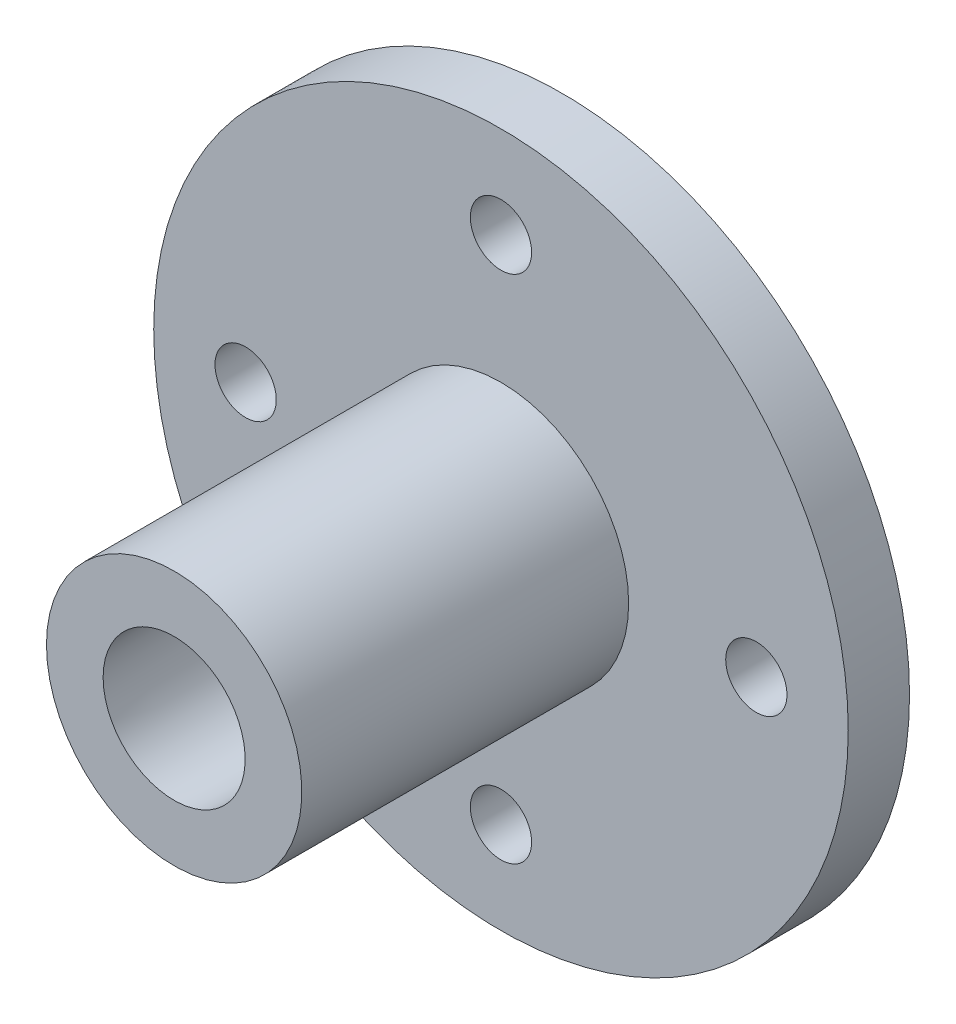
ISO-10303-21;
HEADER;
FILE_DESCRIPTION(('STEP AP214'),'2;1');
FILE_NAME('part.step','',(''),(''),'','','');
FILE_SCHEMA(('AUTOMOTIVE_DESIGN { 1 0 10303 214 1 1 1 1 }'));
ENDSEC;
DATA;
#1=APPLICATION_CONTEXT('core data for automotive mechanical design processes');
#2=APPLICATION_PROTOCOL_DEFINITION('international standard','automotive_design',2000,#1);
#3=PRODUCT_CONTEXT('',#1,'mechanical');
#4=PRODUCT('Part','Part','',(#3));
#5=PRODUCT_RELATED_PRODUCT_CATEGORY('part','',(#4));
#6=PRODUCT_DEFINITION_FORMATION('','',#4);
#7=PRODUCT_DEFINITION_CONTEXT('part definition',#1,'design');
#8=PRODUCT_DEFINITION('design','',#6,#7);
#9=PRODUCT_DEFINITION_SHAPE('','',#8);
#10=(LENGTH_UNIT() NAMED_UNIT(*) SI_UNIT(.MILLI.,.METRE.));
#11=(NAMED_UNIT(*) PLANE_ANGLE_UNIT() SI_UNIT($,.RADIAN.));
#12=(NAMED_UNIT(*) SI_UNIT($,.STERADIAN.) SOLID_ANGLE_UNIT());
#13=UNCERTAINTY_MEASURE_WITH_UNIT(LENGTH_MEASURE(1.E-05),#10,'distance_accuracy_value','');
#14=(GEOMETRIC_REPRESENTATION_CONTEXT(3) GLOBAL_UNCERTAINTY_ASSIGNED_CONTEXT((#13)) GLOBAL_UNIT_ASSIGNED_CONTEXT((#10,
#11,#12)) REPRESENTATION_CONTEXT('',''));
#15=CARTESIAN_POINT('',(0.,0.,0.));
#16=DIRECTION('',(0.,0.,1.));
#17=DIRECTION('',(1.,0.,0.));
#18=AXIS2_PLACEMENT_3D('',#15,#16,#17);
#19=CARTESIAN_POINT('',(12.5,0.,3.));
#20=DIRECTION('',(0.,0.,-1.));
#21=DIRECTION('',(-1.,0.,0.));
#22=AXIS2_PLACEMENT_3D('',#19,#20,#21);
#23=CYLINDRICAL_SURFACE('',#22,1.50000000000013);
#24=CARTESIAN_POINT('',(12.5,0.,3.));
#25=DIRECTION('',(0.,0.,-1.));
#26=DIRECTION('',(-1.,0.,0.));
#27=AXIS2_PLACEMENT_3D('',#24,#25,#26);
#28=CIRCLE('',#27,1.50000000000013);
#29=CARTESIAN_POINT('',(10.9999999999999,0.,3.));
#30=VERTEX_POINT('',#29);
#31=EDGE_CURVE('E68',#30,#30,#28,.T.);
#32=ORIENTED_EDGE('',*,*,#31,.F.);
#33=EDGE_LOOP('',(#32));
#34=FACE_BOUND('',#33,.T.);
#35=CARTESIAN_POINT('',(12.5,0.,0.25));
#36=DIRECTION('',(0.,0.,-1.));
#37=DIRECTION('',(-1.,0.,0.));
#38=AXIS2_PLACEMENT_3D('',#35,#36,#37);
#39=CIRCLE('',#38,1.50000000000013);
#40=CARTESIAN_POINT('',(10.9999999999999,0.,0.25));
#41=VERTEX_POINT('',#40);
#42=EDGE_CURVE('E216',#41,#41,#39,.T.);
#43=ORIENTED_EDGE('',*,*,#42,.T.);
#44=EDGE_LOOP('',(#43));
#45=FACE_BOUND('',#44,.T.);
#46=ADVANCED_FACE('F45',(#34,#45),#23,.F.);
#47=CARTESIAN_POINT('',(0.,-12.5,3.));
#48=DIRECTION('',(0.,0.,-1.));
#49=DIRECTION('',(-1.,0.,0.));
#50=AXIS2_PLACEMENT_3D('',#47,#48,#49);
#51=CYLINDRICAL_SURFACE('',#50,1.50000000000008);
#52=CARTESIAN_POINT('',(0.,-12.5,3.));
#53=DIRECTION('',(0.,0.,-1.));
#54=DIRECTION('',(-1.,0.,0.));
#55=AXIS2_PLACEMENT_3D('',#52,#53,#54);
#56=CIRCLE('',#55,1.50000000000008);
#57=CARTESIAN_POINT('',(-1.50000000000009,-12.5,3.));
#58=VERTEX_POINT('',#57);
#59=EDGE_CURVE('E78',#58,#58,#56,.T.);
#60=ORIENTED_EDGE('',*,*,#59,.F.);
#61=EDGE_LOOP('',(#60));
#62=FACE_BOUND('',#61,.T.);
#63=CARTESIAN_POINT('',(0.,-12.5,0.25));
#64=DIRECTION('',(0.,0.,-1.));
#65=DIRECTION('',(-1.,0.,0.));
#66=AXIS2_PLACEMENT_3D('',#63,#64,#65);
#67=CIRCLE('',#66,1.50000000000009);
#68=CARTESIAN_POINT('',(-1.50000000000009,-12.5,0.25));
#69=VERTEX_POINT('',#68);
#70=EDGE_CURVE('E204',#69,#69,#67,.T.);
#71=ORIENTED_EDGE('',*,*,#70,.T.);
#72=EDGE_LOOP('',(#71));
#73=FACE_BOUND('',#72,.T.);
#74=ADVANCED_FACE('F109',(#62,#73),#51,.F.);
#75=CARTESIAN_POINT('',(-12.5,0.,3.));
#76=DIRECTION('',(0.,0.,-1.));
#77=DIRECTION('',(-1.,0.,0.));
#78=AXIS2_PLACEMENT_3D('',#75,#76,#77);
#79=CYLINDRICAL_SURFACE('',#78,1.50000000000004);
#80=CARTESIAN_POINT('',(-12.5,0.,3.));
#81=DIRECTION('',(0.,0.,-1.));
#82=DIRECTION('',(-1.,0.,0.));
#83=AXIS2_PLACEMENT_3D('',#80,#81,#82);
#84=CIRCLE('',#83,1.50000000000004);
#85=CARTESIAN_POINT('',(-14.,0.,3.));
#86=VERTEX_POINT('',#85);
#87=EDGE_CURVE('E74',#86,#86,#84,.T.);
#88=ORIENTED_EDGE('',*,*,#87,.F.);
#89=EDGE_LOOP('',(#88));
#90=FACE_BOUND('',#89,.T.);
#91=CARTESIAN_POINT('',(-12.5,0.,0.25));
#92=DIRECTION('',(0.,0.,-1.));
#93=DIRECTION('',(-1.,0.,0.));
#94=AXIS2_PLACEMENT_3D('',#91,#92,#93);
#95=CIRCLE('',#94,1.50000000000004);
#96=CARTESIAN_POINT('',(-14.,0.,0.25));
#97=VERTEX_POINT('',#96);
#98=EDGE_CURVE('E199',#97,#97,#95,.T.);
#99=ORIENTED_EDGE('',*,*,#98,.T.);
#100=EDGE_LOOP('',(#99));
#101=FACE_BOUND('',#100,.T.);
#102=ADVANCED_FACE('F115',(#90,#101),#79,.F.);
#103=CARTESIAN_POINT('',(0.,12.5,3.));
#104=DIRECTION('',(0.,0.,-1.));
#105=DIRECTION('',(-1.,0.,0.));
#106=AXIS2_PLACEMENT_3D('',#103,#104,#105);
#107=CYLINDRICAL_SURFACE('',#106,1.5);
#108=CARTESIAN_POINT('',(0.,12.5,3.));
#109=DIRECTION('',(0.,0.,-1.));
#110=DIRECTION('',(-1.,0.,0.));
#111=AXIS2_PLACEMENT_3D('',#108,#109,#110);
#112=CIRCLE('',#111,1.5);
#113=CARTESIAN_POINT('',(-1.5,12.5,3.));
#114=VERTEX_POINT('',#113);
#115=EDGE_CURVE('E69',#114,#114,#112,.T.);
#116=ORIENTED_EDGE('',*,*,#115,.F.);
#117=EDGE_LOOP('',(#116));
#118=FACE_BOUND('',#117,.T.);
#119=CARTESIAN_POINT('',(0.,12.5,0.25));
#120=DIRECTION('',(0.,0.,-1.));
#121=DIRECTION('',(-1.,0.,0.));
#122=AXIS2_PLACEMENT_3D('',#119,#120,#121);
#123=CIRCLE('',#122,1.5);
#124=CARTESIAN_POINT('',(-1.5,12.5,0.25));
#125=VERTEX_POINT('',#124);
#126=EDGE_CURVE('E178',#125,#125,#123,.T.);
#127=ORIENTED_EDGE('',*,*,#126,.T.);
#128=EDGE_LOOP('',(#127));
#129=FACE_BOUND('',#128,.T.);
#130=ADVANCED_FACE('F123',(#118,#129),#107,.F.);
#131=CARTESIAN_POINT('',(0.,0.,3.));
#132=DIRECTION('',(0.,0.,-1.));
#133=DIRECTION('',(-1.,0.,0.));
#134=AXIS2_PLACEMENT_3D('',#131,#132,#133);
#135=CYLINDRICAL_SURFACE('',#134,17.);
#136=CARTESIAN_POINT('',(0.,0.,3.));
#137=DIRECTION('',(0.,0.,1.));
#138=DIRECTION('',(1.,0.,0.));
#139=AXIS2_PLACEMENT_3D('',#136,#137,#138);
#140=CIRCLE('',#139,17.);
#141=CARTESIAN_POINT('',(17.,0.,3.));
#142=VERTEX_POINT('',#141);
#143=EDGE_CURVE('E59',#142,#142,#140,.T.);
#144=ORIENTED_EDGE('',*,*,#143,.F.);
#145=EDGE_LOOP('',(#144));
#146=FACE_BOUND('',#145,.T.);
#147=CARTESIAN_POINT('',(0.,0.,0.));
#148=DIRECTION('',(0.,0.,1.));
#149=DIRECTION('',(1.,0.,0.));
#150=AXIS2_PLACEMENT_3D('',#147,#148,#149);
#151=CIRCLE('',#150,17.);
#152=CARTESIAN_POINT('',(17.,0.,0.));
#153=VERTEX_POINT('',#152);
#154=EDGE_CURVE('E73',#153,#153,#151,.T.);
#155=ORIENTED_EDGE('',*,*,#154,.T.);
#156=EDGE_LOOP('',(#155));
#157=FACE_BOUND('',#156,.T.);
#158=ADVANCED_FACE('F47',(#146,#157),#135,.T.);
#159=CARTESIAN_POINT('',(0.,0.,3.));
#160=DIRECTION('',(0.,0.,1.));
#161=DIRECTION('',(1.,0.,0.));
#162=AXIS2_PLACEMENT_3D('',#159,#160,#161);
#163=PLANE('',#162);
#164=CARTESIAN_POINT('',(0.,0.,3.));
#165=DIRECTION('',(0.,0.,1.));
#166=DIRECTION('',(1.,0.,0.));
#167=AXIS2_PLACEMENT_3D('',#164,#165,#166);
#168=CIRCLE('',#167,6.25);
#169=CARTESIAN_POINT('',(6.25,0.,3.));
#170=VERTEX_POINT('',#169);
#171=EDGE_CURVE('E11',#170,#170,#168,.T.);
#172=ORIENTED_EDGE('',*,*,#171,.F.);
#173=EDGE_LOOP('',(#172));
#174=FACE_BOUND('',#173,.T.);
#175=ORIENTED_EDGE('',*,*,#115,.T.);
#176=EDGE_LOOP('',(#175));
#177=FACE_BOUND('',#176,.T.);
#178=ORIENTED_EDGE('',*,*,#87,.T.);
#179=EDGE_LOOP('',(#178));
#180=FACE_BOUND('',#179,.T.);
#181=ORIENTED_EDGE('',*,*,#59,.T.);
#182=EDGE_LOOP('',(#181));
#183=FACE_BOUND('',#182,.T.);
#184=ORIENTED_EDGE('',*,*,#31,.T.);
#185=EDGE_LOOP('',(#184));
#186=FACE_BOUND('',#185,.T.);
#187=ORIENTED_EDGE('',*,*,#143,.T.);
#188=EDGE_LOOP('',(#187));
#189=FACE_BOUND('',#188,.T.);
#190=ADVANCED_FACE('F95',(#174,#177,#180,#183,#186,#189),#163,.T.);
#191=CARTESIAN_POINT('',(0.,0.,0.));
#192=DIRECTION('',(0.,0.,1.));
#193=DIRECTION('',(1.,0.,0.));
#194=AXIS2_PLACEMENT_3D('',#191,#192,#193);
#195=PLANE('',#194);
#196=CARTESIAN_POINT('',(0.,12.5,0.));
#197=DIRECTION('',(0.,0.,-1.));
#198=DIRECTION('',(-1.,0.,0.));
#199=AXIS2_PLACEMENT_3D('',#196,#197,#198);
#200=CIRCLE('',#199,1.85);
#201=CARTESIAN_POINT('',(-1.85,12.5,0.));
#202=VERTEX_POINT('',#201);
#203=EDGE_CURVE('E184',#202,#202,#200,.T.);
#204=ORIENTED_EDGE('',*,*,#203,.F.);
#205=EDGE_LOOP('',(#204));
#206=FACE_BOUND('',#205,.T.);
#207=CARTESIAN_POINT('',(-12.5,0.,0.));
#208=DIRECTION('',(0.,0.,-1.));
#209=DIRECTION('',(-1.,0.,0.));
#210=AXIS2_PLACEMENT_3D('',#207,#208,#209);
#211=CIRCLE('',#210,1.85);
#212=CARTESIAN_POINT('',(-14.35,0.,0.));
#213=VERTEX_POINT('',#212);
#214=EDGE_CURVE('E195',#213,#213,#211,.T.);
#215=ORIENTED_EDGE('',*,*,#214,.F.);
#216=EDGE_LOOP('',(#215));
#217=FACE_BOUND('',#216,.T.);
#218=CARTESIAN_POINT('',(0.,-12.5,0.));
#219=DIRECTION('',(0.,0.,-1.));
#220=DIRECTION('',(-1.,0.,0.));
#221=AXIS2_PLACEMENT_3D('',#218,#219,#220);
#222=CIRCLE('',#221,1.85);
#223=CARTESIAN_POINT('',(-1.85,-12.5,0.));
#224=VERTEX_POINT('',#223);
#225=EDGE_CURVE('E208',#224,#224,#222,.T.);
#226=ORIENTED_EDGE('',*,*,#225,.F.);
#227=EDGE_LOOP('',(#226));
#228=FACE_BOUND('',#227,.T.);
#229=CARTESIAN_POINT('',(12.5,0.,0.));
#230=DIRECTION('',(0.,0.,-1.));
#231=DIRECTION('',(-1.,0.,0.));
#232=AXIS2_PLACEMENT_3D('',#229,#230,#231);
#233=CIRCLE('',#232,1.85);
#234=CARTESIAN_POINT('',(10.65,0.,0.));
#235=VERTEX_POINT('',#234);
#236=EDGE_CURVE('E220',#235,#235,#233,.T.);
#237=ORIENTED_EDGE('',*,*,#236,.F.);
#238=EDGE_LOOP('',(#237));
#239=FACE_BOUND('',#238,.T.);
#240=CARTESIAN_POINT('',(0.,0.,0.));
#241=DIRECTION('',(0.,0.,1.));
#242=DIRECTION('',(1.,0.,0.));
#243=AXIS2_PLACEMENT_3D('',#240,#241,#242);
#244=CIRCLE('',#243,6.25);
#245=CARTESIAN_POINT('',(6.25,0.,0.));
#246=VERTEX_POINT('',#245);
#247=EDGE_CURVE('E49',#246,#246,#244,.F.);
#248=ORIENTED_EDGE('',*,*,#247,.F.);
#249=EDGE_LOOP('',(#248));
#250=FACE_BOUND('',#249,.T.);
#251=ORIENTED_EDGE('',*,*,#154,.F.);
#252=EDGE_LOOP('',(#251));
#253=FACE_BOUND('',#252,.T.);
#254=ADVANCED_FACE('F92',(#206,#217,#228,#239,#250,#253),#195,.F.);
#255=CARTESIAN_POINT('',(0.,0.,-1.));
#256=DIRECTION('',(0.,0.,1.));
#257=DIRECTION('',(1.,0.,0.));
#258=AXIS2_PLACEMENT_3D('',#255,#256,#257);
#259=CYLINDRICAL_SURFACE('',#258,6.25);
#260=CARTESIAN_POINT('',(0.,0.,-1.));
#261=DIRECTION('',(0.,0.,-1.));
#262=DIRECTION('',(-1.,0.,0.));
#263=AXIS2_PLACEMENT_3D('',#260,#261,#262);
#264=CIRCLE('',#263,6.25);
#265=CARTESIAN_POINT('',(-6.25,0.,-1.));
#266=VERTEX_POINT('',#265);
#267=EDGE_CURVE('E64',#266,#266,#264,.T.);
#268=ORIENTED_EDGE('',*,*,#267,.F.);
#269=EDGE_LOOP('',(#268));
#270=FACE_BOUND('',#269,.T.);
#271=ORIENTED_EDGE('',*,*,#247,.T.);
#272=EDGE_LOOP('',(#271));
#273=FACE_BOUND('',#272,.T.);
#274=ADVANCED_FACE('F94',(#270,#273),#259,.T.);
#275=CARTESIAN_POINT('',(0.,0.,-1.));
#276=DIRECTION('',(0.,0.,-1.));
#277=DIRECTION('',(-1.,0.,0.));
#278=AXIS2_PLACEMENT_3D('',#275,#276,#277);
#279=PLANE('',#278);
#280=CARTESIAN_POINT('',(0.,0.,-1.));
#281=DIRECTION('',(0.,0.,-1.));
#282=DIRECTION('',(-1.,0.,0.));
#283=AXIS2_PLACEMENT_3D('',#280,#281,#282);
#284=CIRCLE('',#283,4.);
#285=CARTESIAN_POINT('',(-4.,0.,-1.));
#286=VERTEX_POINT('',#285);
#287=EDGE_CURVE('E183',#286,#286,#284,.T.);
#288=ORIENTED_EDGE('',*,*,#287,.F.);
#289=EDGE_LOOP('',(#288));
#290=FACE_BOUND('',#289,.T.);
#291=ORIENTED_EDGE('',*,*,#267,.T.);
#292=EDGE_LOOP('',(#291));
#293=FACE_BOUND('',#292,.T.);
#294=ADVANCED_FACE('F101',(#290,#293),#279,.T.);
#295=CARTESIAN_POINT('',(0.,0.,19.));
#296=DIRECTION('',(0.,0.,-1.));
#297=DIRECTION('',(-1.,0.,0.));
#298=AXIS2_PLACEMENT_3D('',#295,#296,#297);
#299=CYLINDRICAL_SURFACE('',#298,6.25);
#300=ORIENTED_EDGE('',*,*,#171,.T.);
#301=EDGE_LOOP('',(#300));
#302=FACE_BOUND('',#301,.T.);
#303=CARTESIAN_POINT('',(0.,0.,19.));
#304=DIRECTION('',(0.,0.,-1.));
#305=DIRECTION('',(-1.,0.,0.));
#306=AXIS2_PLACEMENT_3D('',#303,#304,#305);
#307=CIRCLE('',#306,6.25);
#308=CARTESIAN_POINT('',(-6.25,0.,19.));
#309=VERTEX_POINT('',#308);
#310=EDGE_CURVE('E62',#309,#309,#307,.T.);
#311=ORIENTED_EDGE('',*,*,#310,.T.);
#312=EDGE_LOOP('',(#311));
#313=FACE_BOUND('',#312,.T.);
#314=ADVANCED_FACE('F130',(#302,#313),#299,.T.);
#315=CARTESIAN_POINT('',(0.,0.,19.));
#316=DIRECTION('',(0.,0.,-1.));
#317=DIRECTION('',(-1.,0.,0.));
#318=AXIS2_PLACEMENT_3D('',#315,#316,#317);
#319=PLANE('',#318);
#320=CARTESIAN_POINT('',(0.,0.,19.));
#321=DIRECTION('',(0.,0.,-1.));
#322=DIRECTION('',(-1.,0.,0.));
#323=AXIS2_PLACEMENT_3D('',#320,#321,#322);
#324=CIRCLE('',#323,3.47628156861626);
#325=CARTESIAN_POINT('',(-3.47628156861626,0.,19.));
#326=VERTEX_POINT('',#325);
#327=EDGE_CURVE('E189',#326,#326,#324,.T.);
#328=ORIENTED_EDGE('',*,*,#327,.T.);
#329=EDGE_LOOP('',(#328));
#330=FACE_BOUND('',#329,.T.);
#331=ORIENTED_EDGE('',*,*,#310,.F.);
#332=EDGE_LOOP('',(#331));
#333=FACE_BOUND('',#332,.T.);
#334=ADVANCED_FACE('F134',(#330,#333),#319,.F.);
#335=CARTESIAN_POINT('',(0.,0.,-1.));
#336=DIRECTION('',(0.,0.,-1.));
#337=DIRECTION('',(-1.,0.,0.));
#338=AXIS2_PLACEMENT_3D('',#335,#336,#337);
#339=CONICAL_SURFACE('',#338,4.,0.026179938779915);
#340=ORIENTED_EDGE('',*,*,#327,.F.);
#341=EDGE_LOOP('',(#340));
#342=FACE_BOUND('',#341,.T.);
#343=ORIENTED_EDGE('',*,*,#287,.T.);
#344=EDGE_LOOP('',(#343));
#345=FACE_BOUND('',#344,.T.);
#346=ADVANCED_FACE('F137',(#342,#345),#339,.F.);
#347=CARTESIAN_POINT('',(0.,12.5,0.25));
#348=DIRECTION('',(0.,0.,-1.));
#349=DIRECTION('',(-1.,0.,0.));
#350=AXIS2_PLACEMENT_3D('',#347,#348,#349);
#351=CYLINDRICAL_SURFACE('',#350,1.85);
#352=CARTESIAN_POINT('',(0.,12.5,0.25));
#353=DIRECTION('',(0.,0.,-1.));
#354=DIRECTION('',(-1.,0.,0.));
#355=AXIS2_PLACEMENT_3D('',#352,#353,#354);
#356=CIRCLE('',#355,1.85);
#357=CARTESIAN_POINT('',(-1.85,12.5,0.25));
#358=VERTEX_POINT('',#357);
#359=EDGE_CURVE('E181',#358,#358,#356,.T.);
#360=ORIENTED_EDGE('',*,*,#359,.F.);
#361=EDGE_LOOP('',(#360));
#362=FACE_BOUND('',#361,.T.);
#363=ORIENTED_EDGE('',*,*,#203,.T.);
#364=EDGE_LOOP('',(#363));
#365=FACE_BOUND('',#364,.T.);
#366=ADVANCED_FACE('F141',(#362,#365),#351,.F.);
#367=CARTESIAN_POINT('',(0.,12.5,0.25));
#368=DIRECTION('',(0.,0.,-1.));
#369=DIRECTION('',(-1.,0.,0.));
#370=AXIS2_PLACEMENT_3D('',#367,#368,#369);
#371=PLANE('',#370);
#372=ORIENTED_EDGE('',*,*,#126,.F.);
#373=EDGE_LOOP('',(#372));
#374=FACE_BOUND('',#373,.T.);
#375=ORIENTED_EDGE('',*,*,#359,.T.);
#376=EDGE_LOOP('',(#375));
#377=FACE_BOUND('',#376,.T.);
#378=ADVANCED_FACE('F166',(#374,#377),#371,.T.);
#379=CARTESIAN_POINT('',(-12.5,0.,0.25));
#380=DIRECTION('',(0.,0.,-1.));
#381=DIRECTION('',(-1.,0.,0.));
#382=AXIS2_PLACEMENT_3D('',#379,#380,#381);
#383=CYLINDRICAL_SURFACE('',#382,1.85);
#384=CARTESIAN_POINT('',(-12.5,0.,0.25));
#385=DIRECTION('',(0.,0.,-1.));
#386=DIRECTION('',(-1.,0.,0.));
#387=AXIS2_PLACEMENT_3D('',#384,#385,#386);
#388=CIRCLE('',#387,1.85);
#389=CARTESIAN_POINT('',(-14.35,0.,0.25));
#390=VERTEX_POINT('',#389);
#391=EDGE_CURVE('E200',#390,#390,#388,.T.);
#392=ORIENTED_EDGE('',*,*,#391,.F.);
#393=EDGE_LOOP('',(#392));
#394=FACE_BOUND('',#393,.T.);
#395=ORIENTED_EDGE('',*,*,#214,.T.);
#396=EDGE_LOOP('',(#395));
#397=FACE_BOUND('',#396,.T.);
#398=ADVANCED_FACE('F162',(#394,#397),#383,.F.);
#399=CARTESIAN_POINT('',(-12.5,0.,0.25));
#400=DIRECTION('',(0.,0.,-1.));
#401=DIRECTION('',(-1.,0.,0.));
#402=AXIS2_PLACEMENT_3D('',#399,#400,#401);
#403=PLANE('',#402);
#404=ORIENTED_EDGE('',*,*,#98,.F.);
#405=EDGE_LOOP('',(#404));
#406=FACE_BOUND('',#405,.T.);
#407=ORIENTED_EDGE('',*,*,#391,.T.);
#408=EDGE_LOOP('',(#407));
#409=FACE_BOUND('',#408,.T.);
#410=ADVANCED_FACE('F158',(#406,#409),#403,.T.);
#411=CARTESIAN_POINT('',(0.,-12.5,0.25));
#412=DIRECTION('',(0.,0.,-1.));
#413=DIRECTION('',(-1.,0.,0.));
#414=AXIS2_PLACEMENT_3D('',#411,#412,#413);
#415=CYLINDRICAL_SURFACE('',#414,1.85);
#416=CARTESIAN_POINT('',(0.,-12.5,0.25));
#417=DIRECTION('',(0.,0.,-1.));
#418=DIRECTION('',(-1.,0.,0.));
#419=AXIS2_PLACEMENT_3D('',#416,#417,#418);
#420=CIRCLE('',#419,1.85);
#421=CARTESIAN_POINT('',(-1.85,-12.5,0.25));
#422=VERTEX_POINT('',#421);
#423=EDGE_CURVE('E212',#422,#422,#420,.T.);
#424=ORIENTED_EDGE('',*,*,#423,.F.);
#425=EDGE_LOOP('',(#424));
#426=FACE_BOUND('',#425,.T.);
#427=ORIENTED_EDGE('',*,*,#225,.T.);
#428=EDGE_LOOP('',(#427));
#429=FACE_BOUND('',#428,.T.);
#430=ADVANCED_FACE('F154',(#426,#429),#415,.F.);
#431=CARTESIAN_POINT('',(0.,-12.5,0.25));
#432=DIRECTION('',(0.,0.,-1.));
#433=DIRECTION('',(-1.,0.,0.));
#434=AXIS2_PLACEMENT_3D('',#431,#432,#433);
#435=PLANE('',#434);
#436=ORIENTED_EDGE('',*,*,#70,.F.);
#437=EDGE_LOOP('',(#436));
#438=FACE_BOUND('',#437,.T.);
#439=ORIENTED_EDGE('',*,*,#423,.T.);
#440=EDGE_LOOP('',(#439));
#441=FACE_BOUND('',#440,.T.);
#442=ADVANCED_FACE('F150',(#438,#441),#435,.T.);
#443=CARTESIAN_POINT('',(12.5,0.,0.25));
#444=DIRECTION('',(0.,0.,-1.));
#445=DIRECTION('',(-1.,0.,0.));
#446=AXIS2_PLACEMENT_3D('',#443,#444,#445);
#447=CYLINDRICAL_SURFACE('',#446,1.85);
#448=CARTESIAN_POINT('',(12.5,0.,0.25));
#449=DIRECTION('',(0.,0.,-1.));
#450=DIRECTION('',(-1.,0.,0.));
#451=AXIS2_PLACEMENT_3D('',#448,#449,#450);
#452=CIRCLE('',#451,1.85);
#453=CARTESIAN_POINT('',(10.65,0.,0.25));
#454=VERTEX_POINT('',#453);
#455=EDGE_CURVE('E224',#454,#454,#452,.T.);
#456=ORIENTED_EDGE('',*,*,#455,.F.);
#457=EDGE_LOOP('',(#456));
#458=FACE_BOUND('',#457,.T.);
#459=ORIENTED_EDGE('',*,*,#236,.T.);
#460=EDGE_LOOP('',(#459));
#461=FACE_BOUND('',#460,.T.);
#462=ADVANCED_FACE('F146',(#458,#461),#447,.F.);
#463=CARTESIAN_POINT('',(12.5,0.,0.25));
#464=DIRECTION('',(0.,0.,-1.));
#465=DIRECTION('',(-1.,0.,0.));
#466=AXIS2_PLACEMENT_3D('',#463,#464,#465);
#467=PLANE('',#466);
#468=ORIENTED_EDGE('',*,*,#42,.F.);
#469=EDGE_LOOP('',(#468));
#470=FACE_BOUND('',#469,.T.);
#471=ORIENTED_EDGE('',*,*,#455,.T.);
#472=EDGE_LOOP('',(#471));
#473=FACE_BOUND('',#472,.T.);
#474=ADVANCED_FACE('F143',(#470,#473),#467,.T.);
#475=CLOSED_SHELL('',(#46,#74,#102,#130,#158,#190,#254,#274,#294,#314,#334,#346,#366,#378,#398,
#410,#430,#442,#462,#474));
#476=MANIFOLD_SOLID_BREP('B2',#475);
#477=ADVANCED_BREP_SHAPE_REPRESENTATION('',(#18,#476),#14);
#478=SHAPE_DEFINITION_REPRESENTATION(#9,#477);
ENDSEC;
END-ISO-10303-21;
